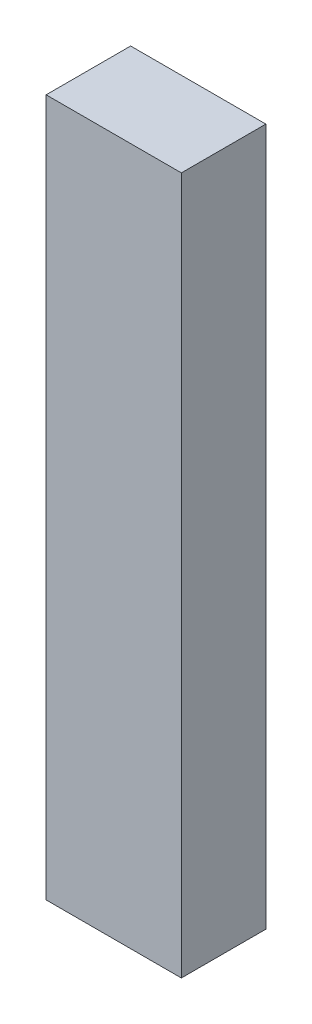
ISO-10303-21;
HEADER;
FILE_DESCRIPTION(('STEP AP214'),'2;1');
FILE_NAME('part.step','',(''),(''),'','','');
FILE_SCHEMA(('AUTOMOTIVE_DESIGN { 1 0 10303 214 1 1 1 1 }'));
ENDSEC;
DATA;
#1=APPLICATION_CONTEXT('core data for automotive mechanical design processes');
#2=APPLICATION_PROTOCOL_DEFINITION('international standard','automotive_design',2000,#1);
#3=PRODUCT_CONTEXT('',#1,'mechanical');
#4=PRODUCT('Part','Part','',(#3));
#5=PRODUCT_RELATED_PRODUCT_CATEGORY('part','',(#4));
#6=PRODUCT_DEFINITION_FORMATION('','',#4);
#7=PRODUCT_DEFINITION_CONTEXT('part definition',#1,'design');
#8=PRODUCT_DEFINITION('design','',#6,#7);
#9=PRODUCT_DEFINITION_SHAPE('','',#8);
#10=(LENGTH_UNIT() NAMED_UNIT(*) SI_UNIT(.MILLI.,.METRE.));
#11=(NAMED_UNIT(*) PLANE_ANGLE_UNIT() SI_UNIT($,.RADIAN.));
#12=(NAMED_UNIT(*) SI_UNIT($,.STERADIAN.) SOLID_ANGLE_UNIT());
#13=UNCERTAINTY_MEASURE_WITH_UNIT(LENGTH_MEASURE(1.E-05),#10,'distance_accuracy_value','');
#14=(GEOMETRIC_REPRESENTATION_CONTEXT(3) GLOBAL_UNCERTAINTY_ASSIGNED_CONTEXT((#13)) GLOBAL_UNIT_ASSIGNED_CONTEXT((#10,
#11,#12)) REPRESENTATION_CONTEXT('',''));
#15=CARTESIAN_POINT('',(0.,0.,0.));
#16=DIRECTION('',(0.,0.,1.));
#17=DIRECTION('',(1.,0.,0.));
#18=AXIS2_PLACEMENT_3D('',#15,#16,#17);
#19=CARTESIAN_POINT('',(160.,825.,200.));
#20=DIRECTION('',(-1.,0.,0.));
#21=DIRECTION('',(0.,-1.,0.));
#22=AXIS2_PLACEMENT_3D('',#19,#20,#21);
#23=PLANE('',#22);
#24=DIRECTION('',(0.,1.,0.));
#25=VECTOR('',#24,1.);
#26=CARTESIAN_POINT('',(160.,825.,0.));
#27=LINE('',#26,#25);
#28=CARTESIAN_POINT('',(160.,-825.,0.));
#29=VERTEX_POINT('',#28);
#30=CARTESIAN_POINT('',(160.,825.,0.));
#31=VERTEX_POINT('',#30);
#32=EDGE_CURVE('E102',#29,#31,#27,.T.);
#33=ORIENTED_EDGE('',*,*,#32,.T.);
#34=DIRECTION('',(0.,0.,-1.));
#35=VECTOR('',#34,1.);
#36=CARTESIAN_POINT('',(160.,825.,200.));
#37=LINE('',#36,#35);
#38=CARTESIAN_POINT('',(160.,825.,200.));
#39=VERTEX_POINT('',#38);
#40=EDGE_CURVE('E11',#39,#31,#37,.T.);
#41=ORIENTED_EDGE('',*,*,#40,.F.);
#42=DIRECTION('',(0.,1.,0.));
#43=VECTOR('',#42,1.);
#44=CARTESIAN_POINT('',(160.,825.,200.));
#45=LINE('',#44,#43);
#46=CARTESIAN_POINT('',(160.,-825.,200.));
#47=VERTEX_POINT('',#46);
#48=EDGE_CURVE('E90',#47,#39,#45,.T.);
#49=ORIENTED_EDGE('',*,*,#48,.F.);
#50=DIRECTION('',(0.,0.,-1.));
#51=VECTOR('',#50,1.);
#52=CARTESIAN_POINT('',(160.,-825.,200.));
#53=LINE('',#52,#51);
#54=EDGE_CURVE('E98',#47,#29,#53,.T.);
#55=ORIENTED_EDGE('',*,*,#54,.T.);
#56=EDGE_LOOP('',(#33,#41,#49,#55));
#57=FACE_BOUND('',#56,.T.);
#58=ADVANCED_FACE('F39',(#57),#23,.F.);
#59=CARTESIAN_POINT('',(-160.,825.,200.));
#60=DIRECTION('',(0.,-1.,0.));
#61=DIRECTION('',(0.,0.,-1.));
#62=AXIS2_PLACEMENT_3D('',#59,#60,#61);
#63=PLANE('',#62);
#64=DIRECTION('',(-1.,0.,0.));
#65=VECTOR('',#64,1.);
#66=CARTESIAN_POINT('',(-160.,825.,0.));
#67=LINE('',#66,#65);
#68=CARTESIAN_POINT('',(-160.,825.,0.));
#69=VERTEX_POINT('',#68);
#70=EDGE_CURVE('E94',#31,#69,#67,.T.);
#71=ORIENTED_EDGE('',*,*,#70,.T.);
#72=DIRECTION('',(0.,0.,-1.));
#73=VECTOR('',#72,1.);
#74=CARTESIAN_POINT('',(-160.,825.,200.));
#75=LINE('',#74,#73);
#76=CARTESIAN_POINT('',(-160.,825.,200.));
#77=VERTEX_POINT('',#76);
#78=EDGE_CURVE('E47',#77,#69,#75,.T.);
#79=ORIENTED_EDGE('',*,*,#78,.F.);
#80=DIRECTION('',(-1.,0.,0.));
#81=VECTOR('',#80,1.);
#82=CARTESIAN_POINT('',(-160.,825.,200.));
#83=LINE('',#82,#81);
#84=EDGE_CURVE('E85',#39,#77,#83,.T.);
#85=ORIENTED_EDGE('',*,*,#84,.F.);
#86=ORIENTED_EDGE('',*,*,#40,.T.);
#87=EDGE_LOOP('',(#71,#79,#85,#86));
#88=FACE_BOUND('',#87,.T.);
#89=ADVANCED_FACE('F93',(#88),#63,.F.);
#90=CARTESIAN_POINT('',(-160.,825.,200.));
#91=DIRECTION('',(1.,0.,0.));
#92=DIRECTION('',(0.,1.,0.));
#93=AXIS2_PLACEMENT_3D('',#90,#91,#92);
#94=PLANE('',#93);
#95=DIRECTION('',(0.,-1.,0.));
#96=VECTOR('',#95,1.);
#97=CARTESIAN_POINT('',(-160.,825.,0.));
#98=LINE('',#97,#96);
#99=CARTESIAN_POINT('',(-160.,-825.,0.));
#100=VERTEX_POINT('',#99);
#101=EDGE_CURVE('E72',#69,#100,#98,.T.);
#102=ORIENTED_EDGE('',*,*,#101,.T.);
#103=DIRECTION('',(0.,0.,-1.));
#104=VECTOR('',#103,1.);
#105=CARTESIAN_POINT('',(-160.,-825.,200.));
#106=LINE('',#105,#104);
#107=CARTESIAN_POINT('',(-160.,-825.,200.));
#108=VERTEX_POINT('',#107);
#109=EDGE_CURVE('E95',#108,#100,#106,.T.);
#110=ORIENTED_EDGE('',*,*,#109,.F.);
#111=DIRECTION('',(0.,-1.,0.));
#112=VECTOR('',#111,1.);
#113=CARTESIAN_POINT('',(-160.,825.,200.));
#114=LINE('',#113,#112);
#115=EDGE_CURVE('E88',#77,#108,#114,.T.);
#116=ORIENTED_EDGE('',*,*,#115,.F.);
#117=ORIENTED_EDGE('',*,*,#78,.T.);
#118=EDGE_LOOP('',(#102,#110,#116,#117));
#119=FACE_BOUND('',#118,.T.);
#120=ADVANCED_FACE('F96',(#119),#94,.F.);
#121=CARTESIAN_POINT('',(-160.,-825.,200.));
#122=DIRECTION('',(0.,1.,0.));
#123=DIRECTION('',(0.,0.,1.));
#124=AXIS2_PLACEMENT_3D('',#121,#122,#123);
#125=PLANE('',#124);
#126=DIRECTION('',(1.,0.,0.));
#127=VECTOR('',#126,1.);
#128=CARTESIAN_POINT('',(-160.,-825.,0.));
#129=LINE('',#128,#127);
#130=EDGE_CURVE('E78',#100,#29,#129,.T.);
#131=ORIENTED_EDGE('',*,*,#130,.T.);
#132=ORIENTED_EDGE('',*,*,#54,.F.);
#133=DIRECTION('',(1.,0.,0.));
#134=VECTOR('',#133,1.);
#135=CARTESIAN_POINT('',(-160.,-825.,200.));
#136=LINE('',#135,#134);
#137=EDGE_CURVE('E55',#108,#47,#136,.T.);
#138=ORIENTED_EDGE('',*,*,#137,.F.);
#139=ORIENTED_EDGE('',*,*,#109,.T.);
#140=EDGE_LOOP('',(#131,#132,#138,#139));
#141=FACE_BOUND('',#140,.T.);
#142=ADVANCED_FACE('F109',(#141),#125,.F.);
#143=CARTESIAN_POINT('',(0.,0.,200.));
#144=DIRECTION('',(0.,0.,1.));
#145=DIRECTION('',(1.,0.,0.));
#146=AXIS2_PLACEMENT_3D('',#143,#144,#145);
#147=PLANE('',#146);
#148=ORIENTED_EDGE('',*,*,#48,.T.);
#149=ORIENTED_EDGE('',*,*,#84,.T.);
#150=ORIENTED_EDGE('',*,*,#115,.T.);
#151=ORIENTED_EDGE('',*,*,#137,.T.);
#152=EDGE_LOOP('',(#148,#149,#150,#151));
#153=FACE_BOUND('',#152,.T.);
#154=ADVANCED_FACE('F86',(#153),#147,.T.);
#155=CARTESIAN_POINT('',(0.,0.,0.));
#156=DIRECTION('',(0.,0.,1.));
#157=DIRECTION('',(1.,0.,0.));
#158=AXIS2_PLACEMENT_3D('',#155,#156,#157);
#159=PLANE('',#158);
#160=ORIENTED_EDGE('',*,*,#32,.F.);
#161=ORIENTED_EDGE('',*,*,#130,.F.);
#162=ORIENTED_EDGE('',*,*,#101,.F.);
#163=ORIENTED_EDGE('',*,*,#70,.F.);
#164=EDGE_LOOP('',(#160,#161,#162,#163));
#165=FACE_BOUND('',#164,.T.);
#166=ADVANCED_FACE('F112',(#165),#159,.F.);
#167=CLOSED_SHELL('',(#58,#89,#120,#142,#154,#166));
#168=MANIFOLD_SOLID_BREP('B2',#167);
#169=ADVANCED_BREP_SHAPE_REPRESENTATION('',(#18,#168),#14);
#170=SHAPE_DEFINITION_REPRESENTATION(#9,#169);
ENDSEC;
END-ISO-10303-21;
